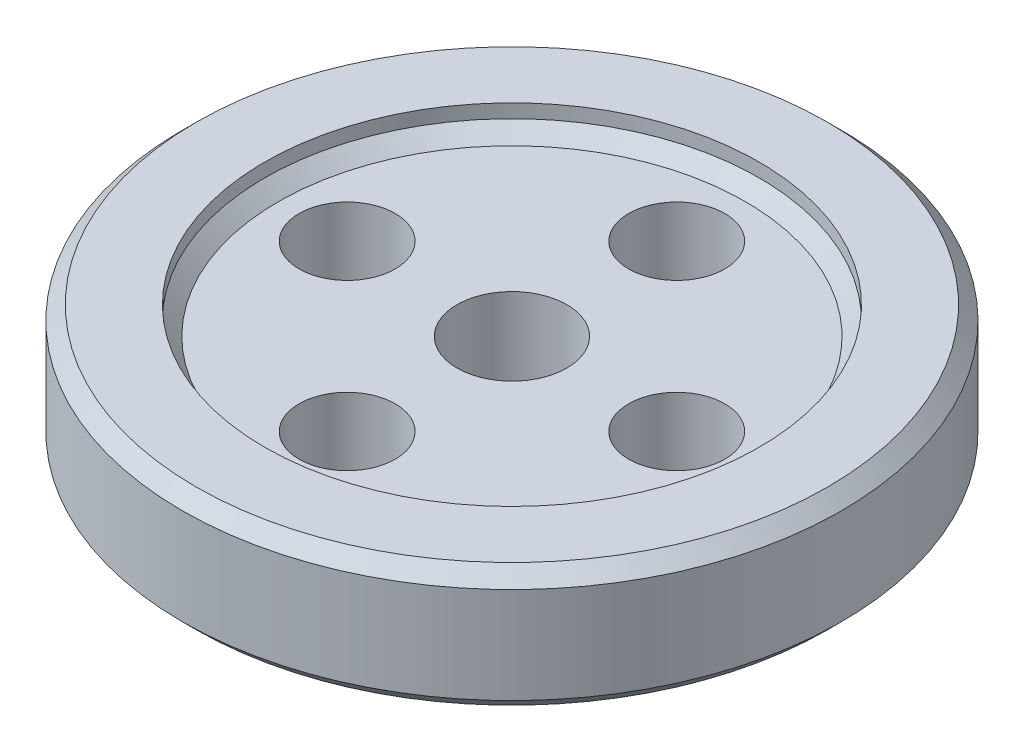
ISO-10303-21;
HEADER;
FILE_DESCRIPTION(('STEP AP214'),'2;1');
FILE_NAME('part.step','',(''),(''),'','','');
FILE_SCHEMA(('AUTOMOTIVE_DESIGN { 1 0 10303 214 1 1 1 1 }'));
ENDSEC;
DATA;
#1=APPLICATION_CONTEXT('core data for automotive mechanical design processes');
#2=APPLICATION_PROTOCOL_DEFINITION('international standard','automotive_design',2000,#1);
#3=PRODUCT_CONTEXT('',#1,'mechanical');
#4=PRODUCT('Part','Part','',(#3));
#5=PRODUCT_RELATED_PRODUCT_CATEGORY('part','',(#4));
#6=PRODUCT_DEFINITION_FORMATION('','',#4);
#7=PRODUCT_DEFINITION_CONTEXT('part definition',#1,'design');
#8=PRODUCT_DEFINITION('design','',#6,#7);
#9=PRODUCT_DEFINITION_SHAPE('','',#8);
#10=(LENGTH_UNIT() NAMED_UNIT(*) SI_UNIT(.MILLI.,.METRE.));
#11=(NAMED_UNIT(*) PLANE_ANGLE_UNIT() SI_UNIT($,.RADIAN.));
#12=(NAMED_UNIT(*) SI_UNIT($,.STERADIAN.) SOLID_ANGLE_UNIT());
#13=UNCERTAINTY_MEASURE_WITH_UNIT(LENGTH_MEASURE(1.E-05),#10,'distance_accuracy_value','');
#14=(GEOMETRIC_REPRESENTATION_CONTEXT(3) GLOBAL_UNCERTAINTY_ASSIGNED_CONTEXT((#13)) GLOBAL_UNIT_ASSIGNED_CONTEXT((#10,
#11,#12)) REPRESENTATION_CONTEXT('',''));
#15=CARTESIAN_POINT('',(0.,0.,0.));
#16=DIRECTION('',(0.,0.,1.));
#17=DIRECTION('',(1.,0.,0.));
#18=AXIS2_PLACEMENT_3D('',#15,#16,#17);
#19=CARTESIAN_POINT('',(0.,9.,0.));
#20=DIRECTION('',(0.,-1.,0.));
#21=DIRECTION('',(0.,0.,-1.));
#22=AXIS2_PLACEMENT_3D('',#19,#20,#21);
#23=CYLINDRICAL_SURFACE('',#22,18.);
#24=CARTESIAN_POINT('',(0.,8.,0.));
#25=DIRECTION('',(0.,1.,0.));
#26=DIRECTION('',(0.,0.,1.));
#27=AXIS2_PLACEMENT_3D('',#24,#25,#26);
#28=CIRCLE('',#27,18.);
#29=CARTESIAN_POINT('',(0.,8.,18.));
#30=VERTEX_POINT('',#29);
#31=EDGE_CURVE('E10',#30,#30,#28,.F.);
#32=ORIENTED_EDGE('',*,*,#31,.T.);
#33=EDGE_LOOP('',(#32));
#34=FACE_BOUND('',#33,.T.);
#35=CARTESIAN_POINT('',(0.,9.,0.));
#36=DIRECTION('',(0.,1.,0.));
#37=DIRECTION('',(0.,0.,1.));
#38=AXIS2_PLACEMENT_3D('',#35,#36,#37);
#39=CIRCLE('',#38,18.);
#40=CARTESIAN_POINT('',(0.,9.,18.));
#41=VERTEX_POINT('',#40);
#42=EDGE_CURVE('E76',#41,#41,#39,.T.);
#43=ORIENTED_EDGE('',*,*,#42,.T.);
#44=EDGE_LOOP('',(#43));
#45=FACE_BOUND('',#44,.T.);
#46=ADVANCED_FACE('F43',(#34,#45),#23,.F.);
#47=CARTESIAN_POINT('',(0.,9.,0.));
#48=DIRECTION('',(0.,-1.,0.));
#49=DIRECTION('',(0.,0.,-1.));
#50=AXIS2_PLACEMENT_3D('',#47,#48,#49);
#51=CYLINDRICAL_SURFACE('',#50,24.);
#52=CARTESIAN_POINT('',(0.,1.,0.));
#53=DIRECTION('',(0.,1.,0.));
#54=DIRECTION('',(0.,0.,1.));
#55=AXIS2_PLACEMENT_3D('',#52,#53,#54);
#56=CIRCLE('',#55,24.);
#57=CARTESIAN_POINT('',(0.,1.,24.));
#58=VERTEX_POINT('',#57);
#59=EDGE_CURVE('E68',#58,#58,#56,.T.);
#60=ORIENTED_EDGE('',*,*,#59,.T.);
#61=EDGE_LOOP('',(#60));
#62=FACE_BOUND('',#61,.T.);
#63=CARTESIAN_POINT('',(0.,8.00000000000002,0.));
#64=DIRECTION('',(0.,1.,0.));
#65=DIRECTION('',(0.,0.,1.));
#66=AXIS2_PLACEMENT_3D('',#63,#64,#65);
#67=CIRCLE('',#66,24.);
#68=CARTESIAN_POINT('',(0.,8.00000000000002,24.));
#69=VERTEX_POINT('',#68);
#70=EDGE_CURVE('E72',#69,#69,#67,.F.);
#71=ORIENTED_EDGE('',*,*,#70,.T.);
#72=EDGE_LOOP('',(#71));
#73=FACE_BOUND('',#72,.T.);
#74=ADVANCED_FACE('F156',(#62,#73),#51,.T.);
#75=CARTESIAN_POINT('',(0.,9.,0.));
#76=DIRECTION('',(0.,1.,0.));
#77=DIRECTION('',(0.,0.,1.));
#78=AXIS2_PLACEMENT_3D('',#75,#76,#77);
#79=PLANE('',#78);
#80=CARTESIAN_POINT('',(0.,9.,0.));
#81=DIRECTION('',(0.,1.,0.));
#82=DIRECTION('',(0.,0.,1.));
#83=AXIS2_PLACEMENT_3D('',#80,#81,#82);
#84=CIRCLE('',#83,23.);
#85=CARTESIAN_POINT('',(0.,9.,23.));
#86=VERTEX_POINT('',#85);
#87=EDGE_CURVE('E57',#86,#86,#84,.T.);
#88=ORIENTED_EDGE('',*,*,#87,.T.);
#89=EDGE_LOOP('',(#88));
#90=FACE_BOUND('',#89,.T.);
#91=ORIENTED_EDGE('',*,*,#42,.F.);
#92=EDGE_LOOP('',(#91));
#93=FACE_BOUND('',#92,.T.);
#94=ADVANCED_FACE('F146',(#90,#93),#79,.T.);
#95=CARTESIAN_POINT('',(0.,0.,0.));
#96=DIRECTION('',(0.,1.,0.));
#97=DIRECTION('',(0.,0.,1.));
#98=AXIS2_PLACEMENT_3D('',#95,#96,#97);
#99=PLANE('',#98);
#100=CARTESIAN_POINT('',(0.,0.,0.));
#101=DIRECTION('',(0.,1.,0.));
#102=DIRECTION('',(0.,0.,1.));
#103=AXIS2_PLACEMENT_3D('',#100,#101,#102);
#104=CIRCLE('',#103,23.);
#105=CARTESIAN_POINT('',(0.,0.,23.));
#106=VERTEX_POINT('',#105);
#107=EDGE_CURVE('E62',#106,#106,#104,.F.);
#108=ORIENTED_EDGE('',*,*,#107,.T.);
#109=EDGE_LOOP('',(#108));
#110=FACE_BOUND('',#109,.T.);
#111=CARTESIAN_POINT('',(-11.9999999999997,0.,3.4032572508536E-13));
#112=DIRECTION('',(0.,1.,0.));
#113=DIRECTION('',(0.,0.,1.));
#114=AXIS2_PLACEMENT_3D('',#111,#112,#113);
#115=CIRCLE('',#114,3.50000000000054);
#116=CARTESIAN_POINT('',(-11.9999999999997,0.,3.50000000000089));
#117=VERTEX_POINT('',#116);
#118=EDGE_CURVE('E98',#117,#117,#115,.T.);
#119=ORIENTED_EDGE('',*,*,#118,.T.);
#120=EDGE_LOOP('',(#119));
#121=FACE_BOUND('',#120,.T.);
#122=CARTESIAN_POINT('',(6.77712297852766E-13,0.,12.));
#123=DIRECTION('',(0.,1.,0.));
#124=DIRECTION('',(0.,0.,1.));
#125=AXIS2_PLACEMENT_3D('',#122,#123,#124);
#126=CIRCLE('',#125,3.50000000000073);
#127=CARTESIAN_POINT('',(6.77712297852766E-13,0.,15.5000000000007));
#128=VERTEX_POINT('',#127);
#129=EDGE_CURVE('E94',#128,#128,#126,.T.);
#130=ORIENTED_EDGE('',*,*,#129,.T.);
#131=EDGE_LOOP('',(#130));
#132=FACE_BOUND('',#131,.T.);
#133=CARTESIAN_POINT('',(12.,0.,0.));
#134=DIRECTION('',(0.,1.,0.));
#135=DIRECTION('',(0.,0.,1.));
#136=AXIS2_PLACEMENT_3D('',#133,#134,#135);
#137=CIRCLE('',#136,3.5);
#138=CARTESIAN_POINT('',(12.,0.,3.50000000000004));
#139=VERTEX_POINT('',#138);
#140=EDGE_CURVE('E90',#139,#139,#137,.T.);
#141=ORIENTED_EDGE('',*,*,#140,.T.);
#142=EDGE_LOOP('',(#141));
#143=FACE_BOUND('',#142,.T.);
#144=CARTESIAN_POINT('',(0.,0.,-12.));
#145=DIRECTION('',(0.,1.,0.));
#146=DIRECTION('',(0.,0.,1.));
#147=AXIS2_PLACEMENT_3D('',#144,#145,#146);
#148=CIRCLE('',#147,3.5);
#149=CARTESIAN_POINT('',(0.,0.,-8.5));
#150=VERTEX_POINT('',#149);
#151=EDGE_CURVE('E86',#150,#150,#148,.T.);
#152=ORIENTED_EDGE('',*,*,#151,.T.);
#153=EDGE_LOOP('',(#152));
#154=FACE_BOUND('',#153,.T.);
#155=CARTESIAN_POINT('',(0.,0.,0.));
#156=DIRECTION('',(0.,1.,0.));
#157=DIRECTION('',(0.,0.,1.));
#158=AXIS2_PLACEMENT_3D('',#155,#156,#157);
#159=CIRCLE('',#158,4.);
#160=CARTESIAN_POINT('',(0.,0.,4.));
#161=VERTEX_POINT('',#160);
#162=EDGE_CURVE('E81',#161,#161,#159,.T.);
#163=ORIENTED_EDGE('',*,*,#162,.T.);
#164=EDGE_LOOP('',(#163));
#165=FACE_BOUND('',#164,.T.);
#166=ADVANCED_FACE('F143',(#110,#121,#132,#143,#154,#165),#99,.F.);
#167=CARTESIAN_POINT('',(0.,7.,-12.));
#168=DIRECTION('',(0.,-1.,0.));
#169=DIRECTION('',(0.,0.,-1.));
#170=AXIS2_PLACEMENT_3D('',#167,#168,#169);
#171=CYLINDRICAL_SURFACE('',#170,3.5);
#172=CARTESIAN_POINT('',(0.,7.,-12.));
#173=DIRECTION('',(0.,1.,0.));
#174=DIRECTION('',(0.,0.,1.));
#175=AXIS2_PLACEMENT_3D('',#172,#173,#174);
#176=CIRCLE('',#175,3.5);
#177=CARTESIAN_POINT('',(0.,7.,-8.5));
#178=VERTEX_POINT('',#177);
#179=EDGE_CURVE('E105',#178,#178,#176,.T.);
#180=ORIENTED_EDGE('',*,*,#179,.T.);
#181=EDGE_LOOP('',(#180));
#182=FACE_BOUND('',#181,.T.);
#183=ORIENTED_EDGE('',*,*,#151,.F.);
#184=EDGE_LOOP('',(#183));
#185=FACE_BOUND('',#184,.T.);
#186=ADVANCED_FACE('F145',(#182,#185),#171,.F.);
#187=CARTESIAN_POINT('',(12.,7.,0.));
#188=DIRECTION('',(0.,-1.,0.));
#189=DIRECTION('',(0.,0.,-1.));
#190=AXIS2_PLACEMENT_3D('',#187,#188,#189);
#191=CYLINDRICAL_SURFACE('',#190,3.5);
#192=CARTESIAN_POINT('',(12.,7.,0.));
#193=DIRECTION('',(0.,1.,0.));
#194=DIRECTION('',(0.,0.,1.));
#195=AXIS2_PLACEMENT_3D('',#192,#193,#194);
#196=CIRCLE('',#195,3.5);
#197=CARTESIAN_POINT('',(12.,7.,3.50000000000004));
#198=VERTEX_POINT('',#197);
#199=EDGE_CURVE('E109',#198,#198,#196,.T.);
#200=ORIENTED_EDGE('',*,*,#199,.T.);
#201=EDGE_LOOP('',(#200));
#202=FACE_BOUND('',#201,.T.);
#203=ORIENTED_EDGE('',*,*,#140,.F.);
#204=EDGE_LOOP('',(#203));
#205=FACE_BOUND('',#204,.T.);
#206=ADVANCED_FACE('F153',(#202,#205),#191,.F.);
#207=CARTESIAN_POINT('',(6.77712297852766E-13,7.,12.));
#208=DIRECTION('',(0.,-1.,0.));
#209=DIRECTION('',(0.,0.,-1.));
#210=AXIS2_PLACEMENT_3D('',#207,#208,#209);
#211=CYLINDRICAL_SURFACE('',#210,3.50000000000073);
#212=CARTESIAN_POINT('',(6.77712297852766E-13,7.,12.));
#213=DIRECTION('',(0.,1.,0.));
#214=DIRECTION('',(0.,0.,1.));
#215=AXIS2_PLACEMENT_3D('',#212,#213,#214);
#216=CIRCLE('',#215,3.50000000000073);
#217=CARTESIAN_POINT('',(6.77712297852766E-13,7.,15.5000000000007));
#218=VERTEX_POINT('',#217);
#219=EDGE_CURVE('E113',#218,#218,#216,.T.);
#220=ORIENTED_EDGE('',*,*,#219,.T.);
#221=EDGE_LOOP('',(#220));
#222=FACE_BOUND('',#221,.T.);
#223=ORIENTED_EDGE('',*,*,#129,.F.);
#224=EDGE_LOOP('',(#223));
#225=FACE_BOUND('',#224,.T.);
#226=ADVANCED_FACE('F248',(#222,#225),#211,.F.);
#227=CARTESIAN_POINT('',(-11.9999999999997,7.,3.4032572508536E-13));
#228=DIRECTION('',(0.,-1.,0.));
#229=DIRECTION('',(0.,0.,-1.));
#230=AXIS2_PLACEMENT_3D('',#227,#228,#229);
#231=CYLINDRICAL_SURFACE('',#230,3.50000000000054);
#232=CARTESIAN_POINT('',(-11.9999999999997,7.,3.4032572508536E-13));
#233=DIRECTION('',(0.,1.,0.));
#234=DIRECTION('',(0.,0.,1.));
#235=AXIS2_PLACEMENT_3D('',#232,#233,#234);
#236=CIRCLE('',#235,3.50000000000054);
#237=CARTESIAN_POINT('',(-11.9999999999997,7.,3.50000000000089));
#238=VERTEX_POINT('',#237);
#239=EDGE_CURVE('E85',#238,#238,#236,.T.);
#240=ORIENTED_EDGE('',*,*,#239,.T.);
#241=EDGE_LOOP('',(#240));
#242=FACE_BOUND('',#241,.T.);
#243=ORIENTED_EDGE('',*,*,#118,.F.);
#244=EDGE_LOOP('',(#243));
#245=FACE_BOUND('',#244,.T.);
#246=ADVANCED_FACE('F121',(#242,#245),#231,.F.);
#247=CARTESIAN_POINT('',(0.,7.,0.));
#248=DIRECTION('',(0.,-1.,0.));
#249=DIRECTION('',(0.,0.,-1.));
#250=AXIS2_PLACEMENT_3D('',#247,#248,#249);
#251=CYLINDRICAL_SURFACE('',#250,4.);
#252=CARTESIAN_POINT('',(0.,7.,0.));
#253=DIRECTION('',(0.,1.,0.));
#254=DIRECTION('',(0.,0.,1.));
#255=AXIS2_PLACEMENT_3D('',#252,#253,#254);
#256=CIRCLE('',#255,4.);
#257=CARTESIAN_POINT('',(0.,7.,4.));
#258=VERTEX_POINT('',#257);
#259=EDGE_CURVE('E80',#258,#258,#256,.T.);
#260=ORIENTED_EDGE('',*,*,#259,.T.);
#261=EDGE_LOOP('',(#260));
#262=FACE_BOUND('',#261,.T.);
#263=ORIENTED_EDGE('',*,*,#162,.F.);
#264=EDGE_LOOP('',(#263));
#265=FACE_BOUND('',#264,.T.);
#266=ADVANCED_FACE('F128',(#262,#265),#251,.F.);
#267=CARTESIAN_POINT('',(0.,7.,0.));
#268=DIRECTION('',(0.,1.,0.));
#269=DIRECTION('',(0.,0.,1.));
#270=AXIS2_PLACEMENT_3D('',#267,#268,#269);
#271=PLANE('',#270);
#272=CARTESIAN_POINT('',(0.,7.,0.));
#273=DIRECTION('',(0.,1.,0.));
#274=DIRECTION('',(0.,0.,1.));
#275=AXIS2_PLACEMENT_3D('',#272,#273,#274);
#276=CIRCLE('',#275,17.);
#277=CARTESIAN_POINT('',(0.,7.,17.));
#278=VERTEX_POINT('',#277);
#279=EDGE_CURVE('E52',#278,#278,#276,.T.);
#280=ORIENTED_EDGE('',*,*,#279,.T.);
#281=EDGE_LOOP('',(#280));
#282=FACE_BOUND('',#281,.T.);
#283=ORIENTED_EDGE('',*,*,#239,.F.);
#284=EDGE_LOOP('',(#283));
#285=FACE_BOUND('',#284,.T.);
#286=ORIENTED_EDGE('',*,*,#219,.F.);
#287=EDGE_LOOP('',(#286));
#288=FACE_BOUND('',#287,.T.);
#289=ORIENTED_EDGE('',*,*,#199,.F.);
#290=EDGE_LOOP('',(#289));
#291=FACE_BOUND('',#290,.T.);
#292=ORIENTED_EDGE('',*,*,#179,.F.);
#293=EDGE_LOOP('',(#292));
#294=FACE_BOUND('',#293,.T.);
#295=ORIENTED_EDGE('',*,*,#259,.F.);
#296=EDGE_LOOP('',(#295));
#297=FACE_BOUND('',#296,.T.);
#298=ADVANCED_FACE('F124',(#282,#285,#288,#291,#294,#297),#271,.T.);
#299=CARTESIAN_POINT('',(0.,1.,0.));
#300=DIRECTION('',(0.,1.,0.));
#301=DIRECTION('',(0.,0.,1.));
#302=AXIS2_PLACEMENT_3D('',#299,#300,#301);
#303=CONICAL_SURFACE('',#302,24.,0.785398163397452);
#304=ORIENTED_EDGE('',*,*,#107,.F.);
#305=EDGE_LOOP('',(#304));
#306=FACE_BOUND('',#305,.T.);
#307=ORIENTED_EDGE('',*,*,#59,.F.);
#308=EDGE_LOOP('',(#307));
#309=FACE_BOUND('',#308,.T.);
#310=ADVANCED_FACE('F127',(#306,#309),#303,.T.);
#311=CARTESIAN_POINT('',(0.,9.,0.));
#312=DIRECTION('',(0.,-1.,0.));
#313=DIRECTION('',(0.,0.,-1.));
#314=AXIS2_PLACEMENT_3D('',#311,#312,#313);
#315=CONICAL_SURFACE('',#314,23.,0.785398163397448);
#316=ORIENTED_EDGE('',*,*,#70,.F.);
#317=EDGE_LOOP('',(#316));
#318=FACE_BOUND('',#317,.T.);
#319=ORIENTED_EDGE('',*,*,#87,.F.);
#320=EDGE_LOOP('',(#319));
#321=FACE_BOUND('',#320,.T.);
#322=ADVANCED_FACE('F174',(#318,#321),#315,.T.);
#323=CARTESIAN_POINT('',(0.,7.,0.));
#324=DIRECTION('',(0.,1.,0.));
#325=DIRECTION('',(0.,0.,1.));
#326=AXIS2_PLACEMENT_3D('',#323,#324,#325);
#327=CONICAL_SURFACE('',#326,17.,0.785398163397449);
#328=ORIENTED_EDGE('',*,*,#31,.F.);
#329=EDGE_LOOP('',(#328));
#330=FACE_BOUND('',#329,.T.);
#331=ORIENTED_EDGE('',*,*,#279,.F.);
#332=EDGE_LOOP('',(#331));
#333=FACE_BOUND('',#332,.T.);
#334=ADVANCED_FACE('F46',(#330,#333),#327,.F.);
#335=CLOSED_SHELL('',(#46,#74,#94,#166,#186,#206,#226,#246,#266,#298,#310,#322,#334));
#336=MANIFOLD_SOLID_BREP('B2',#335);
#337=ADVANCED_BREP_SHAPE_REPRESENTATION('',(#18,#336),#14);
#338=SHAPE_DEFINITION_REPRESENTATION(#9,#337);
ENDSEC;
END-ISO-10303-21;
